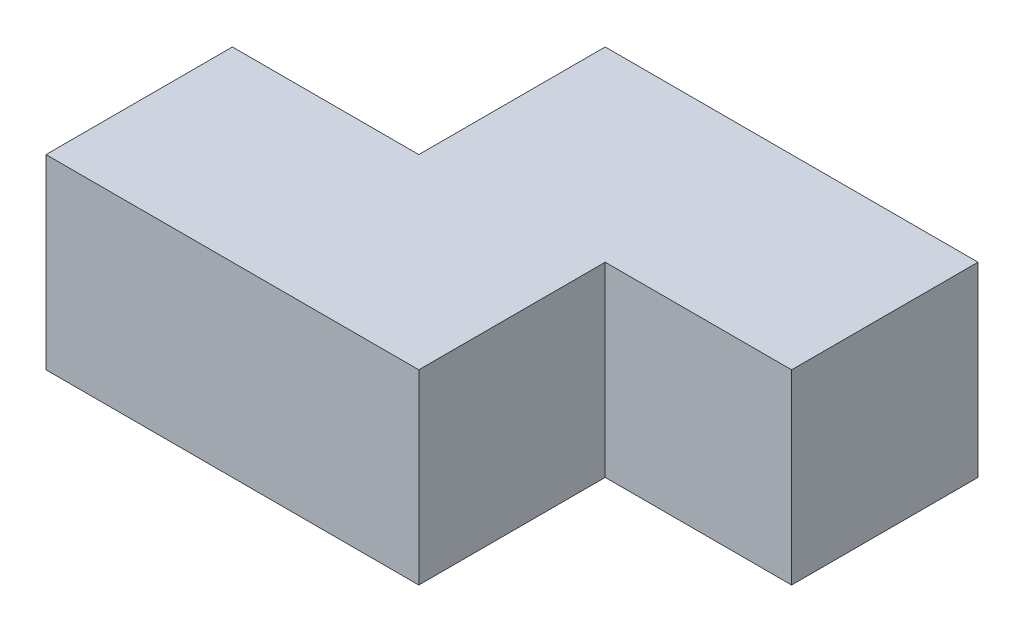
ISO-10303-21;
HEADER;
FILE_DESCRIPTION(('STEP AP214'),'2;1');
FILE_NAME('part.step','',(''),(''),'','','');
FILE_SCHEMA(('AUTOMOTIVE_DESIGN { 1 0 10303 214 1 1 1 1 }'));
ENDSEC;
DATA;
#1=APPLICATION_CONTEXT('core data for automotive mechanical design processes');
#2=APPLICATION_PROTOCOL_DEFINITION('international standard','automotive_design',2000,#1);
#3=PRODUCT_CONTEXT('',#1,'mechanical');
#4=PRODUCT('Part','Part','',(#3));
#5=PRODUCT_RELATED_PRODUCT_CATEGORY('part','',(#4));
#6=PRODUCT_DEFINITION_FORMATION('','',#4);
#7=PRODUCT_DEFINITION_CONTEXT('part definition',#1,'design');
#8=PRODUCT_DEFINITION('design','',#6,#7);
#9=PRODUCT_DEFINITION_SHAPE('','',#8);
#10=(LENGTH_UNIT() NAMED_UNIT(*) SI_UNIT(.MILLI.,.METRE.));
#11=(NAMED_UNIT(*) PLANE_ANGLE_UNIT() SI_UNIT($,.RADIAN.));
#12=(NAMED_UNIT(*) SI_UNIT($,.STERADIAN.) SOLID_ANGLE_UNIT());
#13=UNCERTAINTY_MEASURE_WITH_UNIT(LENGTH_MEASURE(1.E-05),#10,'distance_accuracy_value','');
#14=(GEOMETRIC_REPRESENTATION_CONTEXT(3) GLOBAL_UNCERTAINTY_ASSIGNED_CONTEXT((#13)) GLOBAL_UNIT_ASSIGNED_CONTEXT((#10,
#11,#12)) REPRESENTATION_CONTEXT('',''));
#15=CARTESIAN_POINT('',(0.,0.,0.));
#16=DIRECTION('',(0.,0.,1.));
#17=DIRECTION('',(1.,0.,0.));
#18=AXIS2_PLACEMENT_3D('',#15,#16,#17);
#19=CARTESIAN_POINT('',(60.,30.,0.));
#20=DIRECTION('',(0.,0.,-1.));
#21=DIRECTION('',(-1.,0.,0.));
#22=AXIS2_PLACEMENT_3D('',#19,#20,#21);
#23=PLANE('',#22);
#24=DIRECTION('',(1.,0.,0.));
#25=VECTOR('',#24,1.);
#26=CARTESIAN_POINT('',(60.,0.,0.));
#27=LINE('',#26,#25);
#28=CARTESIAN_POINT('',(0.,0.,0.));
#29=VERTEX_POINT('',#28);
#30=CARTESIAN_POINT('',(60.,0.,0.));
#31=VERTEX_POINT('',#30);
#32=EDGE_CURVE('E139',#29,#31,#27,.T.);
#33=ORIENTED_EDGE('',*,*,#32,.T.);
#34=DIRECTION('',(0.,-1.,0.));
#35=VECTOR('',#34,1.);
#36=CARTESIAN_POINT('',(60.,30.,0.));
#37=LINE('',#36,#35);
#38=CARTESIAN_POINT('',(60.,30.,0.));
#39=VERTEX_POINT('',#38);
#40=EDGE_CURVE('E11',#39,#31,#37,.T.);
#41=ORIENTED_EDGE('',*,*,#40,.F.);
#42=DIRECTION('',(1.,0.,0.));
#43=VECTOR('',#42,1.);
#44=CARTESIAN_POINT('',(60.,30.,0.));
#45=LINE('',#44,#43);
#46=CARTESIAN_POINT('',(0.,30.,0.));
#47=VERTEX_POINT('',#46);
#48=EDGE_CURVE('E153',#47,#39,#45,.T.);
#49=ORIENTED_EDGE('',*,*,#48,.F.);
#50=DIRECTION('',(0.,-1.,0.));
#51=VECTOR('',#50,1.);
#52=CARTESIAN_POINT('',(0.,30.,0.));
#53=LINE('',#52,#51);
#54=EDGE_CURVE('E135',#47,#29,#53,.T.);
#55=ORIENTED_EDGE('',*,*,#54,.T.);
#56=EDGE_LOOP('',(#33,#41,#49,#55));
#57=FACE_BOUND('',#56,.T.);
#58=ADVANCED_FACE('F43',(#57),#23,.F.);
#59=CARTESIAN_POINT('',(60.,30.,-30.));
#60=DIRECTION('',(-1.,0.,0.));
#61=DIRECTION('',(0.,0.,1.));
#62=AXIS2_PLACEMENT_3D('',#59,#60,#61);
#63=PLANE('',#62);
#64=DIRECTION('',(0.,0.,-1.));
#65=VECTOR('',#64,1.);
#66=CARTESIAN_POINT('',(60.,0.,-30.));
#67=LINE('',#66,#65);
#68=CARTESIAN_POINT('',(60.,0.,-30.));
#69=VERTEX_POINT('',#68);
#70=EDGE_CURVE('E142',#31,#69,#67,.T.);
#71=ORIENTED_EDGE('',*,*,#70,.T.);
#72=DIRECTION('',(0.,-1.,0.));
#73=VECTOR('',#72,1.);
#74=CARTESIAN_POINT('',(60.,30.,-30.));
#75=LINE('',#74,#73);
#76=CARTESIAN_POINT('',(60.,30.,-30.));
#77=VERTEX_POINT('',#76);
#78=EDGE_CURVE('E51',#77,#69,#75,.T.);
#79=ORIENTED_EDGE('',*,*,#78,.F.);
#80=DIRECTION('',(0.,0.,-1.));
#81=VECTOR('',#80,1.);
#82=CARTESIAN_POINT('',(60.,30.,-30.));
#83=LINE('',#82,#81);
#84=EDGE_CURVE('E102',#39,#77,#83,.T.);
#85=ORIENTED_EDGE('',*,*,#84,.F.);
#86=ORIENTED_EDGE('',*,*,#40,.T.);
#87=EDGE_LOOP('',(#71,#79,#85,#86));
#88=FACE_BOUND('',#87,.T.);
#89=ADVANCED_FACE('F188',(#88),#63,.F.);
#90=CARTESIAN_POINT('',(90.,30.,-30.));
#91=DIRECTION('',(0.,0.,-1.));
#92=DIRECTION('',(-1.,0.,0.));
#93=AXIS2_PLACEMENT_3D('',#90,#91,#92);
#94=PLANE('',#93);
#95=DIRECTION('',(1.,0.,0.));
#96=VECTOR('',#95,1.);
#97=CARTESIAN_POINT('',(90.,0.,-30.));
#98=LINE('',#97,#96);
#99=CARTESIAN_POINT('',(90.,0.,-30.));
#100=VERTEX_POINT('',#99);
#101=EDGE_CURVE('E144',#69,#100,#98,.T.);
#102=ORIENTED_EDGE('',*,*,#101,.T.);
#103=DIRECTION('',(0.,-1.,0.));
#104=VECTOR('',#103,1.);
#105=CARTESIAN_POINT('',(90.,30.,-30.));
#106=LINE('',#105,#104);
#107=CARTESIAN_POINT('',(90.,30.,-30.));
#108=VERTEX_POINT('',#107);
#109=EDGE_CURVE('E160',#108,#100,#106,.T.);
#110=ORIENTED_EDGE('',*,*,#109,.F.);
#111=DIRECTION('',(1.,0.,0.));
#112=VECTOR('',#111,1.);
#113=CARTESIAN_POINT('',(90.,30.,-30.));
#114=LINE('',#113,#112);
#115=EDGE_CURVE('E168',#77,#108,#114,.T.);
#116=ORIENTED_EDGE('',*,*,#115,.F.);
#117=ORIENTED_EDGE('',*,*,#78,.T.);
#118=EDGE_LOOP('',(#102,#110,#116,#117));
#119=FACE_BOUND('',#118,.T.);
#120=ADVANCED_FACE('F166',(#119),#94,.F.);
#121=CARTESIAN_POINT('',(90.,30.,-60.));
#122=DIRECTION('',(-1.,0.,0.));
#123=DIRECTION('',(0.,0.,1.));
#124=AXIS2_PLACEMENT_3D('',#121,#122,#123);
#125=PLANE('',#124);
#126=DIRECTION('',(0.,0.,-1.));
#127=VECTOR('',#126,1.);
#128=CARTESIAN_POINT('',(90.,0.,-60.));
#129=LINE('',#128,#127);
#130=CARTESIAN_POINT('',(90.,0.,-60.));
#131=VERTEX_POINT('',#130);
#132=EDGE_CURVE('E146',#100,#131,#129,.T.);
#133=ORIENTED_EDGE('',*,*,#132,.T.);
#134=DIRECTION('',(0.,-1.,0.));
#135=VECTOR('',#134,1.);
#136=CARTESIAN_POINT('',(90.,30.,-60.));
#137=LINE('',#136,#135);
#138=CARTESIAN_POINT('',(90.,30.,-60.));
#139=VERTEX_POINT('',#138);
#140=EDGE_CURVE('E157',#139,#131,#137,.T.);
#141=ORIENTED_EDGE('',*,*,#140,.F.);
#142=DIRECTION('',(0.,0.,-1.));
#143=VECTOR('',#142,1.);
#144=CARTESIAN_POINT('',(90.,30.,-60.));
#145=LINE('',#144,#143);
#146=EDGE_CURVE('E180',#108,#139,#145,.T.);
#147=ORIENTED_EDGE('',*,*,#146,.F.);
#148=ORIENTED_EDGE('',*,*,#109,.T.);
#149=EDGE_LOOP('',(#133,#141,#147,#148));
#150=FACE_BOUND('',#149,.T.);
#151=ADVANCED_FACE('F176',(#150),#125,.F.);
#152=CARTESIAN_POINT('',(30.,30.,-60.));
#153=DIRECTION('',(0.,0.,1.));
#154=DIRECTION('',(1.,0.,0.));
#155=AXIS2_PLACEMENT_3D('',#152,#153,#154);
#156=PLANE('',#155);
#157=DIRECTION('',(-1.,0.,0.));
#158=VECTOR('',#157,1.);
#159=CARTESIAN_POINT('',(30.,0.,-60.));
#160=LINE('',#159,#158);
#161=CARTESIAN_POINT('',(30.,0.,-60.));
#162=VERTEX_POINT('',#161);
#163=EDGE_CURVE('E148',#131,#162,#160,.T.);
#164=ORIENTED_EDGE('',*,*,#163,.T.);
#165=DIRECTION('',(0.,-1.,0.));
#166=VECTOR('',#165,1.);
#167=CARTESIAN_POINT('',(30.,30.,-60.));
#168=LINE('',#167,#166);
#169=CARTESIAN_POINT('',(30.,30.,-60.));
#170=VERTEX_POINT('',#169);
#171=EDGE_CURVE('E130',#170,#162,#168,.T.);
#172=ORIENTED_EDGE('',*,*,#171,.F.);
#173=DIRECTION('',(-1.,0.,0.));
#174=VECTOR('',#173,1.);
#175=CARTESIAN_POINT('',(30.,30.,-60.));
#176=LINE('',#175,#174);
#177=EDGE_CURVE('E121',#139,#170,#176,.T.);
#178=ORIENTED_EDGE('',*,*,#177,.F.);
#179=ORIENTED_EDGE('',*,*,#140,.T.);
#180=EDGE_LOOP('',(#164,#172,#178,#179));
#181=FACE_BOUND('',#180,.T.);
#182=ADVANCED_FACE('F179',(#181),#156,.F.);
#183=CARTESIAN_POINT('',(30.,30.,-30.));
#184=DIRECTION('',(1.,0.,0.));
#185=DIRECTION('',(0.,0.,-1.));
#186=AXIS2_PLACEMENT_3D('',#183,#184,#185);
#187=PLANE('',#186);
#188=DIRECTION('',(0.,0.,1.));
#189=VECTOR('',#188,1.);
#190=CARTESIAN_POINT('',(30.,0.,-30.));
#191=LINE('',#190,#189);
#192=CARTESIAN_POINT('',(30.,0.,-30.));
#193=VERTEX_POINT('',#192);
#194=EDGE_CURVE('E129',#162,#193,#191,.T.);
#195=ORIENTED_EDGE('',*,*,#194,.T.);
#196=DIRECTION('',(0.,-1.,0.));
#197=VECTOR('',#196,1.);
#198=CARTESIAN_POINT('',(30.,30.,-30.));
#199=LINE('',#198,#197);
#200=CARTESIAN_POINT('',(30.,30.,-30.));
#201=VERTEX_POINT('',#200);
#202=EDGE_CURVE('E126',#201,#193,#199,.T.);
#203=ORIENTED_EDGE('',*,*,#202,.F.);
#204=DIRECTION('',(0.,0.,1.));
#205=VECTOR('',#204,1.);
#206=CARTESIAN_POINT('',(30.,30.,-30.));
#207=LINE('',#206,#205);
#208=EDGE_CURVE('E115',#170,#201,#207,.T.);
#209=ORIENTED_EDGE('',*,*,#208,.F.);
#210=ORIENTED_EDGE('',*,*,#171,.T.);
#211=EDGE_LOOP('',(#195,#203,#209,#210));
#212=FACE_BOUND('',#211,.T.);
#213=ADVANCED_FACE('F127',(#212),#187,.F.);
#214=CARTESIAN_POINT('',(0.,30.,-30.));
#215=DIRECTION('',(0.,0.,1.));
#216=DIRECTION('',(1.,0.,0.));
#217=AXIS2_PLACEMENT_3D('',#214,#215,#216);
#218=PLANE('',#217);
#219=DIRECTION('',(-1.,0.,0.));
#220=VECTOR('',#219,1.);
#221=CARTESIAN_POINT('',(0.,0.,-30.));
#222=LINE('',#221,#220);
#223=CARTESIAN_POINT('',(0.,0.,-30.));
#224=VERTEX_POINT('',#223);
#225=EDGE_CURVE('E88',#193,#224,#222,.T.);
#226=ORIENTED_EDGE('',*,*,#225,.T.);
#227=DIRECTION('',(0.,-1.,0.));
#228=VECTOR('',#227,1.);
#229=CARTESIAN_POINT('',(0.,30.,-30.));
#230=LINE('',#229,#228);
#231=CARTESIAN_POINT('',(0.,30.,-30.));
#232=VERTEX_POINT('',#231);
#233=EDGE_CURVE('E131',#232,#224,#230,.T.);
#234=ORIENTED_EDGE('',*,*,#233,.F.);
#235=DIRECTION('',(-1.,0.,0.));
#236=VECTOR('',#235,1.);
#237=CARTESIAN_POINT('',(0.,30.,-30.));
#238=LINE('',#237,#236);
#239=EDGE_CURVE('E119',#201,#232,#238,.T.);
#240=ORIENTED_EDGE('',*,*,#239,.F.);
#241=ORIENTED_EDGE('',*,*,#202,.T.);
#242=EDGE_LOOP('',(#226,#234,#240,#241));
#243=FACE_BOUND('',#242,.T.);
#244=ADVANCED_FACE('F133',(#243),#218,.F.);
#245=CARTESIAN_POINT('',(0.,30.,0.));
#246=DIRECTION('',(1.,0.,0.));
#247=DIRECTION('',(0.,0.,-1.));
#248=AXIS2_PLACEMENT_3D('',#245,#246,#247);
#249=PLANE('',#248);
#250=DIRECTION('',(0.,0.,1.));
#251=VECTOR('',#250,1.);
#252=CARTESIAN_POINT('',(0.,0.,0.));
#253=LINE('',#252,#251);
#254=EDGE_CURVE('E94',#224,#29,#253,.T.);
#255=ORIENTED_EDGE('',*,*,#254,.T.);
#256=ORIENTED_EDGE('',*,*,#54,.F.);
#257=DIRECTION('',(0.,0.,1.));
#258=VECTOR('',#257,1.);
#259=CARTESIAN_POINT('',(0.,30.,0.));
#260=LINE('',#259,#258);
#261=EDGE_CURVE('E59',#232,#47,#260,.T.);
#262=ORIENTED_EDGE('',*,*,#261,.F.);
#263=ORIENTED_EDGE('',*,*,#233,.T.);
#264=EDGE_LOOP('',(#255,#256,#262,#263));
#265=FACE_BOUND('',#264,.T.);
#266=ADVANCED_FACE('F204',(#265),#249,.F.);
#267=CARTESIAN_POINT('',(0.,30.,0.));
#268=DIRECTION('',(0.,-1.,0.));
#269=DIRECTION('',(0.,0.,-1.));
#270=AXIS2_PLACEMENT_3D('',#267,#268,#269);
#271=PLANE('',#270);
#272=ORIENTED_EDGE('',*,*,#48,.T.);
#273=ORIENTED_EDGE('',*,*,#84,.T.);
#274=ORIENTED_EDGE('',*,*,#115,.T.);
#275=ORIENTED_EDGE('',*,*,#146,.T.);
#276=ORIENTED_EDGE('',*,*,#177,.T.);
#277=ORIENTED_EDGE('',*,*,#208,.T.);
#278=ORIENTED_EDGE('',*,*,#239,.T.);
#279=ORIENTED_EDGE('',*,*,#261,.T.);
#280=EDGE_LOOP('',(#272,#273,#274,#275,#276,#277,#278,#279));
#281=FACE_BOUND('',#280,.T.);
#282=ADVANCED_FACE('F117',(#281),#271,.F.);
#283=CARTESIAN_POINT('',(0.,0.,0.));
#284=DIRECTION('',(0.,-1.,0.));
#285=DIRECTION('',(0.,0.,-1.));
#286=AXIS2_PLACEMENT_3D('',#283,#284,#285);
#287=PLANE('',#286);
#288=ORIENTED_EDGE('',*,*,#32,.F.);
#289=ORIENTED_EDGE('',*,*,#254,.F.);
#290=ORIENTED_EDGE('',*,*,#225,.F.);
#291=ORIENTED_EDGE('',*,*,#194,.F.);
#292=ORIENTED_EDGE('',*,*,#163,.F.);
#293=ORIENTED_EDGE('',*,*,#132,.F.);
#294=ORIENTED_EDGE('',*,*,#101,.F.);
#295=ORIENTED_EDGE('',*,*,#70,.F.);
#296=EDGE_LOOP('',(#288,#289,#290,#291,#292,#293,#294,#295));
#297=FACE_BOUND('',#296,.T.);
#298=ADVANCED_FACE('F172',(#297),#287,.T.);
#299=CLOSED_SHELL('',(#58,#89,#120,#151,#182,#213,#244,#266,#282,#298));
#300=MANIFOLD_SOLID_BREP('B2',#299);
#301=ADVANCED_BREP_SHAPE_REPRESENTATION('',(#18,#300),#14);
#302=SHAPE_DEFINITION_REPRESENTATION(#9,#301);
ENDSEC;
END-ISO-10303-21;
